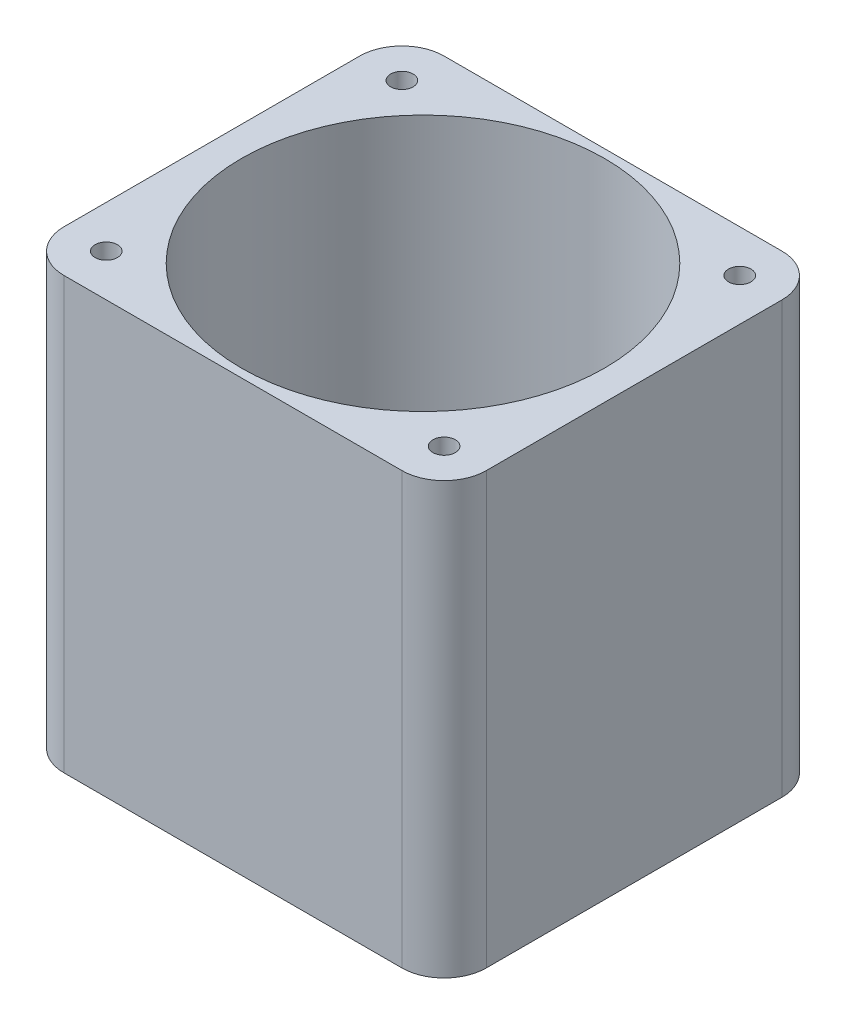
ISO-10303-21;
HEADER;
FILE_DESCRIPTION(('STEP AP214'),'2;1');
FILE_NAME('part.step','',(''),(''),'','','');
FILE_SCHEMA(('AUTOMOTIVE_DESIGN { 1 0 10303 214 1 1 1 1 }'));
ENDSEC;
DATA;
#1=APPLICATION_CONTEXT('core data for automotive mechanical design processes');
#2=APPLICATION_PROTOCOL_DEFINITION('international standard','automotive_design',2000,#1);
#3=PRODUCT_CONTEXT('',#1,'mechanical');
#4=PRODUCT('Part','Part','',(#3));
#5=PRODUCT_RELATED_PRODUCT_CATEGORY('part','',(#4));
#6=PRODUCT_DEFINITION_FORMATION('','',#4);
#7=PRODUCT_DEFINITION_CONTEXT('part definition',#1,'design');
#8=PRODUCT_DEFINITION('design','',#6,#7);
#9=PRODUCT_DEFINITION_SHAPE('','',#8);
#10=(LENGTH_UNIT() NAMED_UNIT(*) SI_UNIT(.MILLI.,.METRE.));
#11=(NAMED_UNIT(*) PLANE_ANGLE_UNIT() SI_UNIT($,.RADIAN.));
#12=(NAMED_UNIT(*) SI_UNIT($,.STERADIAN.) SOLID_ANGLE_UNIT());
#13=UNCERTAINTY_MEASURE_WITH_UNIT(LENGTH_MEASURE(1.E-05),#10,'distance_accuracy_value','');
#14=(GEOMETRIC_REPRESENTATION_CONTEXT(3) GLOBAL_UNCERTAINTY_ASSIGNED_CONTEXT((#13)) GLOBAL_UNIT_ASSIGNED_CONTEXT((#10,
#11,#12)) REPRESENTATION_CONTEXT('',''));
#15=CARTESIAN_POINT('',(0.,0.,0.));
#16=DIRECTION('',(0.,0.,1.));
#17=DIRECTION('',(1.,0.,0.));
#18=AXIS2_PLACEMENT_3D('',#15,#16,#17);
#19=CARTESIAN_POINT('',(40.,102.,35.));
#20=DIRECTION('',(0.,1.,0.));
#21=DIRECTION('',(0.,0.,1.));
#22=AXIS2_PLACEMENT_3D('',#19,#20,#21);
#23=PLANE('',#22);
#24=CARTESIAN_POINT('',(0.,102.,0.));
#25=DIRECTION('',(0.,1.,0.));
#26=DIRECTION('',(0.,0.,1.));
#27=AXIS2_PLACEMENT_3D('',#24,#25,#26);
#28=CIRCLE('',#27,43.);
#29=CARTESIAN_POINT('',(0.,102.,43.));
#30=VERTEX_POINT('',#29);
#31=EDGE_CURVE('E252',#30,#30,#28,.T.);
#32=ORIENTED_EDGE('',*,*,#31,.F.);
#33=EDGE_LOOP('',(#32));
#34=FACE_BOUND('',#33,.T.);
#35=CARTESIAN_POINT('',(40.,102.,35.));
#36=DIRECTION('',(0.,1.,0.));
#37=DIRECTION('',(0.,0.,1.));
#38=AXIS2_PLACEMENT_3D('',#35,#36,#37);
#39=CIRCLE('',#38,2.65);
#40=CARTESIAN_POINT('',(40.,102.,37.65));
#41=VERTEX_POINT('',#40);
#42=EDGE_CURVE('E233',#41,#41,#39,.T.);
#43=ORIENTED_EDGE('',*,*,#42,.F.);
#44=EDGE_LOOP('',(#43));
#45=FACE_BOUND('',#44,.T.);
#46=CARTESIAN_POINT('',(-40.,102.,-35.));
#47=DIRECTION('',(0.,1.,0.));
#48=DIRECTION('',(0.,0.,1.));
#49=AXIS2_PLACEMENT_3D('',#46,#47,#48);
#50=CIRCLE('',#49,2.65);
#51=CARTESIAN_POINT('',(-40.,102.,-32.35));
#52=VERTEX_POINT('',#51);
#53=EDGE_CURVE('E157',#52,#52,#50,.T.);
#54=ORIENTED_EDGE('',*,*,#53,.F.);
#55=EDGE_LOOP('',(#54));
#56=FACE_BOUND('',#55,.T.);
#57=CARTESIAN_POINT('',(40.,102.,35.));
#58=DIRECTION('',(0.,1.,0.));
#59=DIRECTION('',(0.,0.,1.));
#60=AXIS2_PLACEMENT_3D('',#57,#58,#59);
#61=CIRCLE('',#60,10.);
#62=CARTESIAN_POINT('',(40.,102.,45.));
#63=VERTEX_POINT('',#62);
#64=CARTESIAN_POINT('',(50.,102.,35.));
#65=VERTEX_POINT('',#64);
#66=EDGE_CURVE('E174',#63,#65,#61,.T.);
#67=ORIENTED_EDGE('',*,*,#66,.T.);
#68=DIRECTION('',(0.,0.,-1.));
#69=VECTOR('',#68,1.);
#70=CARTESIAN_POINT('',(50.,102.,-35.));
#71=LINE('',#70,#69);
#72=CARTESIAN_POINT('',(50.,102.,-35.));
#73=VERTEX_POINT('',#72);
#74=EDGE_CURVE('E108',#65,#73,#71,.T.);
#75=ORIENTED_EDGE('',*,*,#74,.T.);
#76=CARTESIAN_POINT('',(40.,102.,-35.));
#77=DIRECTION('',(0.,1.,0.));
#78=DIRECTION('',(0.,0.,-1.));
#79=AXIS2_PLACEMENT_3D('',#76,#77,#78);
#80=CIRCLE('',#79,10.);
#81=CARTESIAN_POINT('',(40.,102.,-45.));
#82=VERTEX_POINT('',#81);
#83=EDGE_CURVE('E196',#73,#82,#80,.T.);
#84=ORIENTED_EDGE('',*,*,#83,.T.);
#85=DIRECTION('',(-1.,0.,0.));
#86=VECTOR('',#85,1.);
#87=CARTESIAN_POINT('',(-40.,102.,-45.));
#88=LINE('',#87,#86);
#89=CARTESIAN_POINT('',(-40.,102.,-45.));
#90=VERTEX_POINT('',#89);
#91=EDGE_CURVE('E210',#82,#90,#88,.T.);
#92=ORIENTED_EDGE('',*,*,#91,.T.);
#93=CARTESIAN_POINT('',(-40.,102.,-35.));
#94=DIRECTION('',(0.,1.,0.));
#95=DIRECTION('',(0.,0.,1.));
#96=AXIS2_PLACEMENT_3D('',#93,#94,#95);
#97=CIRCLE('',#96,10.);
#98=CARTESIAN_POINT('',(-50.,102.,-35.));
#99=VERTEX_POINT('',#98);
#100=EDGE_CURVE('E127',#90,#99,#97,.T.);
#101=ORIENTED_EDGE('',*,*,#100,.T.);
#102=DIRECTION('',(0.,0.,1.));
#103=VECTOR('',#102,1.);
#104=CARTESIAN_POINT('',(-50.,102.,-35.));
#105=LINE('',#104,#103);
#106=CARTESIAN_POINT('',(-50.,102.,35.));
#107=VERTEX_POINT('',#106);
#108=EDGE_CURVE('E121',#99,#107,#105,.T.);
#109=ORIENTED_EDGE('',*,*,#108,.T.);
#110=CARTESIAN_POINT('',(-40.,102.,35.));
#111=DIRECTION('',(0.,1.,0.));
#112=DIRECTION('',(0.,0.,1.));
#113=AXIS2_PLACEMENT_3D('',#110,#111,#112);
#114=CIRCLE('',#113,9.99999999999999);
#115=CARTESIAN_POINT('',(-40.,102.,45.));
#116=VERTEX_POINT('',#115);
#117=EDGE_CURVE('E125',#107,#116,#114,.T.);
#118=ORIENTED_EDGE('',*,*,#117,.T.);
#119=DIRECTION('',(1.,0.,0.));
#120=VECTOR('',#119,1.);
#121=CARTESIAN_POINT('',(-40.,102.,45.));
#122=LINE('',#121,#120);
#123=EDGE_CURVE('E65',#116,#63,#122,.T.);
#124=ORIENTED_EDGE('',*,*,#123,.T.);
#125=EDGE_LOOP('',(#67,#75,#84,#92,#101,#109,#118,#124));
#126=FACE_BOUND('',#125,.T.);
#127=CARTESIAN_POINT('',(40.,102.,-35.));
#128=DIRECTION('',(0.,1.,0.));
#129=DIRECTION('',(0.,0.,-1.));
#130=AXIS2_PLACEMENT_3D('',#127,#128,#129);
#131=CIRCLE('',#130,2.65);
#132=CARTESIAN_POINT('',(40.,102.,-37.65));
#133=VERTEX_POINT('',#132);
#134=EDGE_CURVE('E226',#133,#133,#131,.T.);
#135=ORIENTED_EDGE('',*,*,#134,.F.);
#136=EDGE_LOOP('',(#135));
#137=FACE_BOUND('',#136,.T.);
#138=CARTESIAN_POINT('',(-40.,102.,35.));
#139=DIRECTION('',(0.,1.,0.));
#140=DIRECTION('',(0.,0.,-1.));
#141=AXIS2_PLACEMENT_3D('',#138,#139,#140);
#142=CIRCLE('',#141,2.65);
#143=CARTESIAN_POINT('',(-40.,102.,32.35));
#144=VERTEX_POINT('',#143);
#145=EDGE_CURVE('E241',#144,#144,#142,.T.);
#146=ORIENTED_EDGE('',*,*,#145,.F.);
#147=EDGE_LOOP('',(#146));
#148=FACE_BOUND('',#147,.T.);
#149=ADVANCED_FACE('F47',(#34,#45,#56,#126,#137,#148),#23,.T.);
#150=CARTESIAN_POINT('',(40.,0.,35.));
#151=DIRECTION('',(0.,1.,0.));
#152=DIRECTION('',(0.,0.,1.));
#153=AXIS2_PLACEMENT_3D('',#150,#151,#152);
#154=PLANE('',#153);
#155=CARTESIAN_POINT('',(0.,0.,0.));
#156=DIRECTION('',(0.,1.,0.));
#157=DIRECTION('',(0.,0.,1.));
#158=AXIS2_PLACEMENT_3D('',#155,#156,#157);
#159=CIRCLE('',#158,43.);
#160=CARTESIAN_POINT('',(0.,0.,43.));
#161=VERTEX_POINT('',#160);
#162=EDGE_CURVE('E248',#161,#161,#159,.T.);
#163=ORIENTED_EDGE('',*,*,#162,.T.);
#164=EDGE_LOOP('',(#163));
#165=FACE_BOUND('',#164,.T.);
#166=CARTESIAN_POINT('',(40.,0.,35.));
#167=DIRECTION('',(0.,1.,0.));
#168=DIRECTION('',(0.,0.,1.));
#169=AXIS2_PLACEMENT_3D('',#166,#167,#168);
#170=CIRCLE('',#169,10.);
#171=CARTESIAN_POINT('',(40.,0.,45.));
#172=VERTEX_POINT('',#171);
#173=CARTESIAN_POINT('',(50.,0.,35.));
#174=VERTEX_POINT('',#173);
#175=EDGE_CURVE('E152',#172,#174,#170,.T.);
#176=ORIENTED_EDGE('',*,*,#175,.F.);
#177=DIRECTION('',(1.,0.,0.));
#178=VECTOR('',#177,1.);
#179=CARTESIAN_POINT('',(-40.,0.,45.));
#180=LINE('',#179,#178);
#181=CARTESIAN_POINT('',(-40.,0.,45.));
#182=VERTEX_POINT('',#181);
#183=EDGE_CURVE('E100',#182,#172,#180,.T.);
#184=ORIENTED_EDGE('',*,*,#183,.F.);
#185=CARTESIAN_POINT('',(-40.,0.,35.));
#186=DIRECTION('',(0.,1.,0.));
#187=DIRECTION('',(0.,0.,1.));
#188=AXIS2_PLACEMENT_3D('',#185,#186,#187);
#189=CIRCLE('',#188,9.99999999999999);
#190=CARTESIAN_POINT('',(-50.,0.,35.));
#191=VERTEX_POINT('',#190);
#192=EDGE_CURVE('E94',#191,#182,#189,.T.);
#193=ORIENTED_EDGE('',*,*,#192,.F.);
#194=DIRECTION('',(0.,0.,1.));
#195=VECTOR('',#194,1.);
#196=CARTESIAN_POINT('',(-50.,0.,-35.));
#197=LINE('',#196,#195);
#198=CARTESIAN_POINT('',(-50.,0.,-35.));
#199=VERTEX_POINT('',#198);
#200=EDGE_CURVE('E136',#199,#191,#197,.T.);
#201=ORIENTED_EDGE('',*,*,#200,.F.);
#202=CARTESIAN_POINT('',(-40.,0.,-35.));
#203=DIRECTION('',(0.,1.,0.));
#204=DIRECTION('',(0.,0.,1.));
#205=AXIS2_PLACEMENT_3D('',#202,#203,#204);
#206=CIRCLE('',#205,10.);
#207=CARTESIAN_POINT('',(-40.,0.,-45.));
#208=VERTEX_POINT('',#207);
#209=EDGE_CURVE('E166',#208,#199,#206,.T.);
#210=ORIENTED_EDGE('',*,*,#209,.F.);
#211=DIRECTION('',(-1.,0.,0.));
#212=VECTOR('',#211,1.);
#213=CARTESIAN_POINT('',(-40.,0.,-45.));
#214=LINE('',#213,#212);
#215=CARTESIAN_POINT('',(40.,0.,-45.));
#216=VERTEX_POINT('',#215);
#217=EDGE_CURVE('E163',#216,#208,#214,.T.);
#218=ORIENTED_EDGE('',*,*,#217,.F.);
#219=CARTESIAN_POINT('',(40.,0.,-35.));
#220=DIRECTION('',(0.,1.,0.));
#221=DIRECTION('',(0.,0.,-1.));
#222=AXIS2_PLACEMENT_3D('',#219,#220,#221);
#223=CIRCLE('',#222,10.);
#224=CARTESIAN_POINT('',(50.,0.,-35.));
#225=VERTEX_POINT('',#224);
#226=EDGE_CURVE('E160',#225,#216,#223,.T.);
#227=ORIENTED_EDGE('',*,*,#226,.F.);
#228=DIRECTION('',(0.,0.,-1.));
#229=VECTOR('',#228,1.);
#230=CARTESIAN_POINT('',(50.,0.,-35.));
#231=LINE('',#230,#229);
#232=EDGE_CURVE('E156',#174,#225,#231,.T.);
#233=ORIENTED_EDGE('',*,*,#232,.F.);
#234=EDGE_LOOP('',(#176,#184,#193,#201,#210,#218,#227,#233));
#235=FACE_BOUND('',#234,.T.);
#236=CARTESIAN_POINT('',(-40.,0.,-35.));
#237=DIRECTION('',(0.,1.,0.));
#238=DIRECTION('',(0.,0.,1.));
#239=AXIS2_PLACEMENT_3D('',#236,#237,#238);
#240=CIRCLE('',#239,2.65);
#241=CARTESIAN_POINT('',(-40.,0.,-32.35));
#242=VERTEX_POINT('',#241);
#243=EDGE_CURVE('E222',#242,#242,#240,.T.);
#244=ORIENTED_EDGE('',*,*,#243,.T.);
#245=EDGE_LOOP('',(#244));
#246=FACE_BOUND('',#245,.T.);
#247=CARTESIAN_POINT('',(40.,0.,-35.));
#248=DIRECTION('',(0.,1.,0.));
#249=DIRECTION('',(0.,0.,-1.));
#250=AXIS2_PLACEMENT_3D('',#247,#248,#249);
#251=CIRCLE('',#250,2.65);
#252=CARTESIAN_POINT('',(40.,0.,-37.65));
#253=VERTEX_POINT('',#252);
#254=EDGE_CURVE('E229',#253,#253,#251,.T.);
#255=ORIENTED_EDGE('',*,*,#254,.T.);
#256=EDGE_LOOP('',(#255));
#257=FACE_BOUND('',#256,.T.);
#258=CARTESIAN_POINT('',(40.,0.,35.));
#259=DIRECTION('',(0.,1.,0.));
#260=DIRECTION('',(0.,0.,1.));
#261=AXIS2_PLACEMENT_3D('',#258,#259,#260);
#262=CIRCLE('',#261,2.65);
#263=CARTESIAN_POINT('',(40.,0.,37.65));
#264=VERTEX_POINT('',#263);
#265=EDGE_CURVE('E237',#264,#264,#262,.T.);
#266=ORIENTED_EDGE('',*,*,#265,.T.);
#267=EDGE_LOOP('',(#266));
#268=FACE_BOUND('',#267,.T.);
#269=CARTESIAN_POINT('',(-40.,0.,35.));
#270=DIRECTION('',(0.,1.,0.));
#271=DIRECTION('',(0.,0.,-1.));
#272=AXIS2_PLACEMENT_3D('',#269,#270,#271);
#273=CIRCLE('',#272,2.65);
#274=CARTESIAN_POINT('',(-40.,0.,32.35));
#275=VERTEX_POINT('',#274);
#276=EDGE_CURVE('E245',#275,#275,#273,.T.);
#277=ORIENTED_EDGE('',*,*,#276,.T.);
#278=EDGE_LOOP('',(#277));
#279=FACE_BOUND('',#278,.T.);
#280=ADVANCED_FACE('F200',(#165,#235,#246,#257,#268,#279),#154,.F.);
#281=CARTESIAN_POINT('',(40.,102.,35.));
#282=DIRECTION('',(0.,-1.,0.));
#283=DIRECTION('',(0.,0.,-1.));
#284=AXIS2_PLACEMENT_3D('',#281,#282,#283);
#285=CYLINDRICAL_SURFACE('',#284,10.);
#286=ORIENTED_EDGE('',*,*,#175,.T.);
#287=DIRECTION('',(0.,-1.,0.));
#288=VECTOR('',#287,1.);
#289=CARTESIAN_POINT('',(50.,102.,35.));
#290=LINE('',#289,#288);
#291=EDGE_CURVE('E11',#65,#174,#290,.T.);
#292=ORIENTED_EDGE('',*,*,#291,.F.);
#293=ORIENTED_EDGE('',*,*,#66,.F.);
#294=DIRECTION('',(0.,-1.,0.));
#295=VECTOR('',#294,1.);
#296=CARTESIAN_POINT('',(40.,102.,45.));
#297=LINE('',#296,#295);
#298=EDGE_CURVE('E148',#63,#172,#297,.T.);
#299=ORIENTED_EDGE('',*,*,#298,.T.);
#300=EDGE_LOOP('',(#286,#292,#293,#299));
#301=FACE_BOUND('',#300,.T.);
#302=ADVANCED_FACE('F49',(#301),#285,.T.);
#303=CARTESIAN_POINT('',(50.,102.,-35.));
#304=DIRECTION('',(-1.,0.,0.));
#305=DIRECTION('',(0.,0.,1.));
#306=AXIS2_PLACEMENT_3D('',#303,#304,#305);
#307=PLANE('',#306);
#308=ORIENTED_EDGE('',*,*,#232,.T.);
#309=DIRECTION('',(0.,-1.,0.));
#310=VECTOR('',#309,1.);
#311=CARTESIAN_POINT('',(50.,102.,-35.));
#312=LINE('',#311,#310);
#313=EDGE_CURVE('E57',#73,#225,#312,.T.);
#314=ORIENTED_EDGE('',*,*,#313,.F.);
#315=ORIENTED_EDGE('',*,*,#74,.F.);
#316=ORIENTED_EDGE('',*,*,#291,.T.);
#317=EDGE_LOOP('',(#308,#314,#315,#316));
#318=FACE_BOUND('',#317,.T.);
#319=ADVANCED_FACE('F316',(#318),#307,.F.);
#320=CARTESIAN_POINT('',(40.,102.,-35.));
#321=DIRECTION('',(0.,-1.,0.));
#322=DIRECTION('',(0.,0.,-1.));
#323=AXIS2_PLACEMENT_3D('',#320,#321,#322);
#324=CYLINDRICAL_SURFACE('',#323,10.);
#325=ORIENTED_EDGE('',*,*,#226,.T.);
#326=DIRECTION('',(0.,-1.,0.));
#327=VECTOR('',#326,1.);
#328=CARTESIAN_POINT('',(40.,102.,-45.));
#329=LINE('',#328,#327);
#330=EDGE_CURVE('E185',#82,#216,#329,.T.);
#331=ORIENTED_EDGE('',*,*,#330,.F.);
#332=ORIENTED_EDGE('',*,*,#83,.F.);
#333=ORIENTED_EDGE('',*,*,#313,.T.);
#334=EDGE_LOOP('',(#325,#331,#332,#333));
#335=FACE_BOUND('',#334,.T.);
#336=ADVANCED_FACE('F194',(#335),#324,.T.);
#337=CARTESIAN_POINT('',(-40.,102.,-45.));
#338=DIRECTION('',(0.,0.,1.));
#339=DIRECTION('',(1.,0.,0.));
#340=AXIS2_PLACEMENT_3D('',#337,#338,#339);
#341=PLANE('',#340);
#342=ORIENTED_EDGE('',*,*,#217,.T.);
#343=DIRECTION('',(0.,-1.,0.));
#344=VECTOR('',#343,1.);
#345=CARTESIAN_POINT('',(-40.,102.,-45.));
#346=LINE('',#345,#344);
#347=EDGE_CURVE('E181',#90,#208,#346,.T.);
#348=ORIENTED_EDGE('',*,*,#347,.F.);
#349=ORIENTED_EDGE('',*,*,#91,.F.);
#350=ORIENTED_EDGE('',*,*,#330,.T.);
#351=EDGE_LOOP('',(#342,#348,#349,#350));
#352=FACE_BOUND('',#351,.T.);
#353=ADVANCED_FACE('F205',(#352),#341,.F.);
#354=CARTESIAN_POINT('',(-40.,102.,-35.));
#355=DIRECTION('',(0.,-1.,0.));
#356=DIRECTION('',(0.,0.,-1.));
#357=AXIS2_PLACEMENT_3D('',#354,#355,#356);
#358=CYLINDRICAL_SURFACE('',#357,10.);
#359=ORIENTED_EDGE('',*,*,#209,.T.);
#360=DIRECTION('',(0.,-1.,0.));
#361=VECTOR('',#360,1.);
#362=CARTESIAN_POINT('',(-50.,102.,-35.));
#363=LINE('',#362,#361);
#364=EDGE_CURVE('E138',#99,#199,#363,.T.);
#365=ORIENTED_EDGE('',*,*,#364,.F.);
#366=ORIENTED_EDGE('',*,*,#100,.F.);
#367=ORIENTED_EDGE('',*,*,#347,.T.);
#368=EDGE_LOOP('',(#359,#365,#366,#367));
#369=FACE_BOUND('',#368,.T.);
#370=ADVANCED_FACE('F208',(#369),#358,.T.);
#371=CARTESIAN_POINT('',(-50.,102.,-35.));
#372=DIRECTION('',(1.,0.,0.));
#373=DIRECTION('',(0.,0.,-1.));
#374=AXIS2_PLACEMENT_3D('',#371,#372,#373);
#375=PLANE('',#374);
#376=ORIENTED_EDGE('',*,*,#200,.T.);
#377=DIRECTION('',(0.,-1.,0.));
#378=VECTOR('',#377,1.);
#379=CARTESIAN_POINT('',(-50.,102.,35.));
#380=LINE('',#379,#378);
#381=EDGE_CURVE('E133',#107,#191,#380,.T.);
#382=ORIENTED_EDGE('',*,*,#381,.F.);
#383=ORIENTED_EDGE('',*,*,#108,.F.);
#384=ORIENTED_EDGE('',*,*,#364,.T.);
#385=EDGE_LOOP('',(#376,#382,#383,#384));
#386=FACE_BOUND('',#385,.T.);
#387=ADVANCED_FACE('F134',(#386),#375,.F.);
#388=CARTESIAN_POINT('',(-40.,102.,35.));
#389=DIRECTION('',(0.,-1.,0.));
#390=DIRECTION('',(0.,0.,-1.));
#391=AXIS2_PLACEMENT_3D('',#388,#389,#390);
#392=CYLINDRICAL_SURFACE('',#391,9.99999999999999);
#393=ORIENTED_EDGE('',*,*,#192,.T.);
#394=DIRECTION('',(0.,-1.,0.));
#395=VECTOR('',#394,1.);
#396=CARTESIAN_POINT('',(-40.,102.,45.));
#397=LINE('',#396,#395);
#398=EDGE_CURVE('E139',#116,#182,#397,.T.);
#399=ORIENTED_EDGE('',*,*,#398,.F.);
#400=ORIENTED_EDGE('',*,*,#117,.F.);
#401=ORIENTED_EDGE('',*,*,#381,.T.);
#402=EDGE_LOOP('',(#393,#399,#400,#401));
#403=FACE_BOUND('',#402,.T.);
#404=ADVANCED_FACE('F141',(#403),#392,.T.);
#405=CARTESIAN_POINT('',(-40.,102.,45.));
#406=DIRECTION('',(0.,0.,-1.));
#407=DIRECTION('',(-1.,0.,0.));
#408=AXIS2_PLACEMENT_3D('',#405,#406,#407);
#409=PLANE('',#408);
#410=ORIENTED_EDGE('',*,*,#183,.T.);
#411=ORIENTED_EDGE('',*,*,#298,.F.);
#412=ORIENTED_EDGE('',*,*,#123,.F.);
#413=ORIENTED_EDGE('',*,*,#398,.T.);
#414=EDGE_LOOP('',(#410,#411,#412,#413));
#415=FACE_BOUND('',#414,.T.);
#416=ADVANCED_FACE('F280',(#415),#409,.F.);
#417=CARTESIAN_POINT('',(-40.,102.,-35.));
#418=DIRECTION('',(0.,-1.,0.));
#419=DIRECTION('',(0.,0.,-1.));
#420=AXIS2_PLACEMENT_3D('',#417,#418,#419);
#421=CYLINDRICAL_SURFACE('',#420,2.65);
#422=ORIENTED_EDGE('',*,*,#53,.T.);
#423=EDGE_LOOP('',(#422));
#424=FACE_BOUND('',#423,.T.);
#425=ORIENTED_EDGE('',*,*,#243,.F.);
#426=EDGE_LOOP('',(#425));
#427=FACE_BOUND('',#426,.T.);
#428=ADVANCED_FACE('F276',(#424,#427),#421,.F.);
#429=CARTESIAN_POINT('',(40.,102.,-35.));
#430=DIRECTION('',(0.,-1.,0.));
#431=DIRECTION('',(0.,0.,-1.));
#432=AXIS2_PLACEMENT_3D('',#429,#430,#431);
#433=CYLINDRICAL_SURFACE('',#432,2.65);
#434=ORIENTED_EDGE('',*,*,#134,.T.);
#435=EDGE_LOOP('',(#434));
#436=FACE_BOUND('',#435,.T.);
#437=ORIENTED_EDGE('',*,*,#254,.F.);
#438=EDGE_LOOP('',(#437));
#439=FACE_BOUND('',#438,.T.);
#440=ADVANCED_FACE('F279',(#436,#439),#433,.F.);
#441=CARTESIAN_POINT('',(40.,102.,35.));
#442=DIRECTION('',(0.,-1.,0.));
#443=DIRECTION('',(0.,0.,-1.));
#444=AXIS2_PLACEMENT_3D('',#441,#442,#443);
#445=CYLINDRICAL_SURFACE('',#444,2.65);
#446=ORIENTED_EDGE('',*,*,#42,.T.);
#447=EDGE_LOOP('',(#446));
#448=FACE_BOUND('',#447,.T.);
#449=ORIENTED_EDGE('',*,*,#265,.F.);
#450=EDGE_LOOP('',(#449));
#451=FACE_BOUND('',#450,.T.);
#452=ADVANCED_FACE('F293',(#448,#451),#445,.F.);
#453=CARTESIAN_POINT('',(-40.,102.,35.));
#454=DIRECTION('',(0.,-1.,0.));
#455=DIRECTION('',(0.,0.,-1.));
#456=AXIS2_PLACEMENT_3D('',#453,#454,#455);
#457=CYLINDRICAL_SURFACE('',#456,2.65);
#458=ORIENTED_EDGE('',*,*,#145,.T.);
#459=EDGE_LOOP('',(#458));
#460=FACE_BOUND('',#459,.T.);
#461=ORIENTED_EDGE('',*,*,#276,.F.);
#462=EDGE_LOOP('',(#461));
#463=FACE_BOUND('',#462,.T.);
#464=ADVANCED_FACE('F265',(#460,#463),#457,.F.);
#465=CARTESIAN_POINT('',(0.,0.,0.));
#466=DIRECTION('',(0.,1.,0.));
#467=DIRECTION('',(0.,0.,1.));
#468=AXIS2_PLACEMENT_3D('',#465,#466,#467);
#469=CYLINDRICAL_SURFACE('',#468,43.);
#470=ORIENTED_EDGE('',*,*,#162,.F.);
#471=EDGE_LOOP('',(#470));
#472=FACE_BOUND('',#471,.T.);
#473=ORIENTED_EDGE('',*,*,#31,.T.);
#474=EDGE_LOOP('',(#473));
#475=FACE_BOUND('',#474,.T.);
#476=ADVANCED_FACE('F262',(#472,#475),#469,.F.);
#477=CLOSED_SHELL('',(#149,#280,#302,#319,#336,#353,#370,#387,#404,#416,#428,#440,#452,#464,#476));
#478=MANIFOLD_SOLID_BREP('B2',#477);
#479=ADVANCED_BREP_SHAPE_REPRESENTATION('',(#18,#478),#14);
#480=SHAPE_DEFINITION_REPRESENTATION(#9,#479);
ENDSEC;
END-ISO-10303-21;
